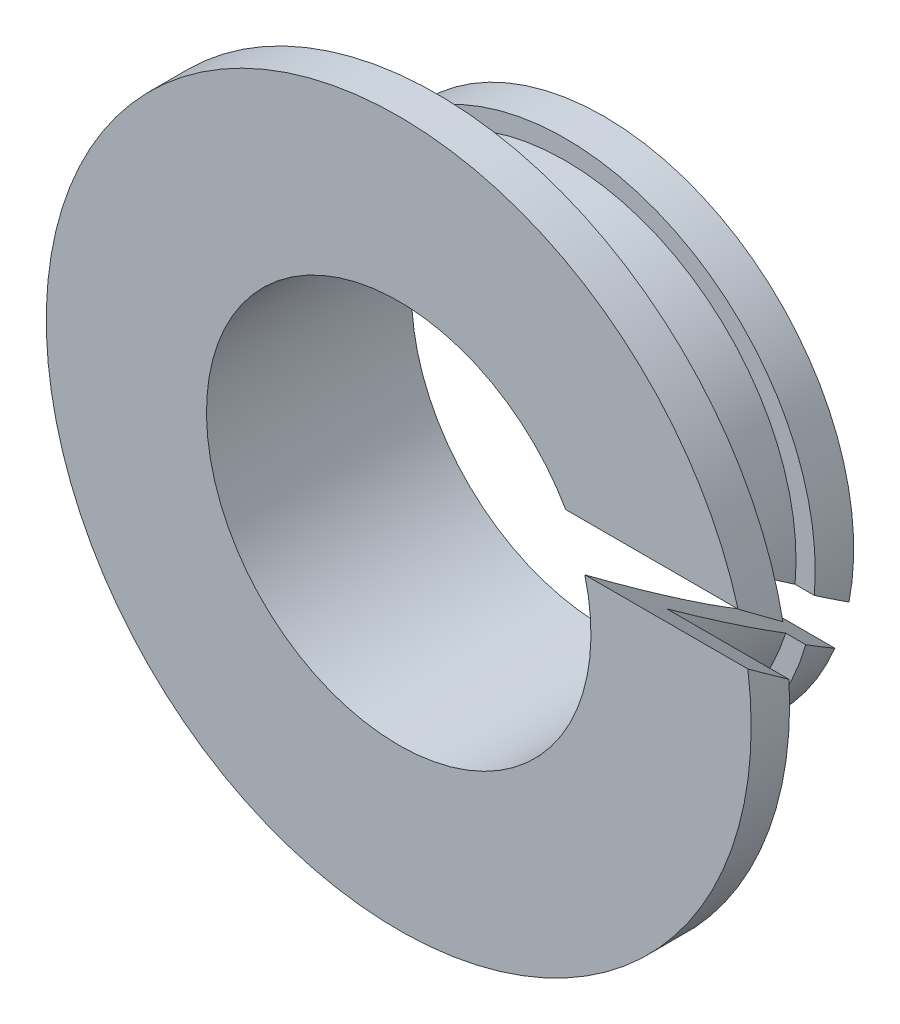
ISO-10303-21;
HEADER;
FILE_DESCRIPTION(('STEP AP214'),'2;1');
FILE_NAME('part.step','',(''),(''),'','','');
FILE_SCHEMA(('AUTOMOTIVE_DESIGN { 1 0 10303 214 1 1 1 1 }'));
ENDSEC;
DATA;
#1=APPLICATION_CONTEXT('core data for automotive mechanical design processes');
#2=APPLICATION_PROTOCOL_DEFINITION('international standard','automotive_design',2000,#1);
#3=PRODUCT_CONTEXT('',#1,'mechanical');
#4=PRODUCT('Part','Part','',(#3));
#5=PRODUCT_RELATED_PRODUCT_CATEGORY('part','',(#4));
#6=PRODUCT_DEFINITION_FORMATION('','',#4);
#7=PRODUCT_DEFINITION_CONTEXT('part definition',#1,'design');
#8=PRODUCT_DEFINITION('design','',#6,#7);
#9=PRODUCT_DEFINITION_SHAPE('','',#8);
#10=(LENGTH_UNIT() NAMED_UNIT(*) SI_UNIT(.MILLI.,.METRE.));
#11=(NAMED_UNIT(*) PLANE_ANGLE_UNIT() SI_UNIT($,.RADIAN.));
#12=(NAMED_UNIT(*) SI_UNIT($,.STERADIAN.) SOLID_ANGLE_UNIT());
#13=UNCERTAINTY_MEASURE_WITH_UNIT(LENGTH_MEASURE(1.E-05),#10,'distance_accuracy_value','');
#14=(GEOMETRIC_REPRESENTATION_CONTEXT(3) GLOBAL_UNCERTAINTY_ASSIGNED_CONTEXT((#13)) GLOBAL_UNIT_ASSIGNED_CONTEXT((#10,
#11,#12)) REPRESENTATION_CONTEXT('',''));
#15=CARTESIAN_POINT('',(0.,0.,0.));
#16=DIRECTION('',(0.,0.,1.));
#17=DIRECTION('',(1.,0.,0.));
#18=AXIS2_PLACEMENT_3D('',#15,#16,#17);
#19=CARTESIAN_POINT('',(0.,0.,0.6));
#20=DIRECTION('',(0.,0.,-1.));
#21=DIRECTION('',(-1.,0.,0.));
#22=AXIS2_PLACEMENT_3D('',#19,#20,#21);
#23=CYLINDRICAL_SURFACE('',#22,3.9);
#24=CARTESIAN_POINT('',(0.,0.,0.));
#25=DIRECTION('',(0.,0.,-1.));
#26=DIRECTION('',(-1.,0.,0.));
#27=AXIS2_PLACEMENT_3D('',#24,#25,#26);
#28=CIRCLE('',#27,3.9);
#29=CARTESIAN_POINT('',(3.60556877238189,-1.48656443776399,0.));
#30=VERTEX_POINT('',#29);
#31=CARTESIAN_POINT('',(3.82639956954659,-0.754099684507085,0.));
#32=VERTEX_POINT('',#31);
#33=EDGE_CURVE('E135',#30,#32,#28,.T.);
#34=ORIENTED_EDGE('',*,*,#33,.F.);
#35=CARTESIAN_POINT('',(0.,0.,2.12303403868634));
#36=DIRECTION('',(0.,0.81915204428899,-0.573576436351049));
#37=DIRECTION('',(0.,-0.573576436351049,-0.81915204428899));
#38=AXIS2_PLACEMENT_3D('',#35,#36,#37);
#39=ELLIPSE('',#38,6.79944250292225,3.9);
#40=CARTESIAN_POINT('',(3.75136054092912,-1.06643991483816,0.6));
#41=VERTEX_POINT('',#40);
#42=EDGE_CURVE('E44',#41,#30,#39,.T.);
#43=ORIENTED_EDGE('',*,*,#42,.F.);
#44=CARTESIAN_POINT('',(0.,0.,0.6));
#45=DIRECTION('',(0.,0.,-1.));
#46=DIRECTION('',(-1.,0.,0.));
#47=AXIS2_PLACEMENT_3D('',#44,#45,#46);
#48=CIRCLE('',#47,3.9);
#49=CARTESIAN_POINT('',(3.88567376286877,-0.333975161581263,0.6));
#50=VERTEX_POINT('',#49);
#51=EDGE_CURVE('E130',#41,#50,#48,.T.);
#52=ORIENTED_EDGE('',*,*,#51,.T.);
#53=CARTESIAN_POINT('',(0.,0.,1.07696596131366));
#54=DIRECTION('',(0.,-0.819152044288994,0.573576436351043));
#55=DIRECTION('',(0.,-0.573576436351043,-0.819152044288994));
#56=AXIS2_PLACEMENT_3D('',#53,#54,#55);
#57=ELLIPSE('',#56,6.79944250292232,3.9);
#58=EDGE_CURVE('E65',#50,#32,#57,.F.);
#59=ORIENTED_EDGE('',*,*,#58,.T.);
#60=EDGE_LOOP('',(#34,#43,#52,#59));
#61=FACE_BOUND('',#60,.T.);
#62=ADVANCED_FACE('F35',(#61),#23,.T.);
#63=CARTESIAN_POINT('',(2.98135214146983,0.333975161581271,2.6));
#64=DIRECTION('',(0.,0.81915204428899,-0.573576436351049));
#65=DIRECTION('',(0.,0.573576436351049,0.81915204428899));
#66=AXIS2_PLACEMENT_3D('',#63,#64,#65);
#67=PLANE('',#66);
#68=DIRECTION('',(1.,0.,0.));
#69=VECTOR('',#68,1.);
#70=CARTESIAN_POINT('',(0.,-1.48656443776399,0.));
#71=LINE('',#70,#69);
#72=CARTESIAN_POINT('',(2.60578705430345,-1.48656443776399,0.));
#73=VERTEX_POINT('',#72);
#74=EDGE_CURVE('E125',#73,#30,#71,.T.);
#75=ORIENTED_EDGE('',*,*,#74,.F.);
#76=CARTESIAN_POINT('',(0.,0.,2.12303403868634));
#77=DIRECTION('',(0.,0.81915204428899,-0.573576436351049));
#78=DIRECTION('',(0.,-0.573576436351049,-0.81915204428899));
#79=AXIS2_PLACEMENT_3D('',#76,#77,#78);
#80=ELLIPSE('',#79,5.23034038686327,3.);
#81=CARTESIAN_POINT('',(2.90367588856372,0.754099684507098,3.2));
#82=VERTEX_POINT('',#81);
#83=EDGE_CURVE('E114',#82,#73,#80,.T.);
#84=ORIENTED_EDGE('',*,*,#83,.F.);
#85=DIRECTION('',(-1.,0.,0.));
#86=VECTOR('',#85,1.);
#87=CARTESIAN_POINT('',(2.98135214146983,0.754099684507098,3.2));
#88=LINE('',#87,#86);
#89=CARTESIAN_POINT('',(5.44805778840738,0.754099684507098,3.2));
#90=VERTEX_POINT('',#89);
#91=EDGE_CURVE('E149',#90,#82,#88,.T.);
#92=ORIENTED_EDGE('',*,*,#91,.F.);
#93=CARTESIAN_POINT('',(0.,0.,2.12303403868634));
#94=DIRECTION('',(0.,0.81915204428899,-0.573576436351049));
#95=DIRECTION('',(0.,-0.573576436351049,-0.81915204428899));
#96=AXIS2_PLACEMENT_3D('',#93,#94,#95);
#97=ELLIPSE('',#96,9.58895737591599,5.5);
#98=CARTESIAN_POINT('',(5.4898506893582,0.333975161581271,2.6));
#99=VERTEX_POINT('',#98);
#100=EDGE_CURVE('E145',#90,#99,#97,.T.);
#101=ORIENTED_EDGE('',*,*,#100,.T.);
#102=DIRECTION('',(-1.,0.,0.));
#103=VECTOR('',#102,1.);
#104=CARTESIAN_POINT('',(2.98135214146983,0.333975161581271,2.6));
#105=LINE('',#104,#103);
#106=CARTESIAN_POINT('',(3.58447493943629,0.333975161581271,2.6));
#107=VERTEX_POINT('',#106);
#108=EDGE_CURVE('E170',#99,#107,#105,.T.);
#109=ORIENTED_EDGE('',*,*,#108,.T.);
#110=CARTESIAN_POINT('',(0.,0.,2.12303403868634));
#111=DIRECTION('',(0.,0.81915204428899,-0.573576436351049));
#112=DIRECTION('',(0.,-0.573576436351049,-0.81915204428899));
#113=AXIS2_PLACEMENT_3D('',#110,#111,#112);
#114=ELLIPSE('',#113,6.27640846423593,3.6);
#115=CARTESIAN_POINT('',(3.4384161918011,-1.06643991483816,0.6));
#116=VERTEX_POINT('',#115);
#117=EDGE_CURVE('E99',#107,#116,#114,.T.);
#118=ORIENTED_EDGE('',*,*,#117,.T.);
#119=DIRECTION('',(1.,0.,0.));
#120=VECTOR('',#119,1.);
#121=CARTESIAN_POINT('',(0.,-1.06643991483816,0.6));
#122=LINE('',#121,#120);
#123=EDGE_CURVE('E140',#116,#41,#122,.T.);
#124=ORIENTED_EDGE('',*,*,#123,.T.);
#125=ORIENTED_EDGE('',*,*,#42,.T.);
#126=EDGE_LOOP('',(#75,#84,#92,#101,#109,#118,#124,#125));
#127=FACE_BOUND('',#126,.T.);
#128=ADVANCED_FACE('F129',(#127),#67,.T.);
#129=CARTESIAN_POINT('',(5.39561914038046,1.06643991483815,2.6));
#130=DIRECTION('',(0.,-0.819152044288994,0.573576436351043));
#131=DIRECTION('',(0.,-0.573576436351043,-0.819152044288994));
#132=AXIS2_PLACEMENT_3D('',#129,#130,#131);
#133=PLANE('',#132);
#134=DIRECTION('',(-1.,0.,0.));
#135=VECTOR('',#134,1.);
#136=CARTESIAN_POINT('',(0.,-0.754099684507085,0.));
#137=LINE('',#136,#135);
#138=CARTESIAN_POINT('',(2.90367588856372,-0.754099684507085,0.));
#139=VERTEX_POINT('',#138);
#140=EDGE_CURVE('E126',#32,#139,#137,.T.);
#141=ORIENTED_EDGE('',*,*,#140,.F.);
#142=ORIENTED_EDGE('',*,*,#58,.F.);
#143=DIRECTION('',(-1.,0.,0.));
#144=VECTOR('',#143,1.);
#145=CARTESIAN_POINT('',(0.,-0.333975161581263,0.6));
#146=LINE('',#145,#144);
#147=CARTESIAN_POINT('',(3.58447493943629,-0.333975161581263,0.6));
#148=VERTEX_POINT('',#147);
#149=EDGE_CURVE('E133',#50,#148,#146,.T.);
#150=ORIENTED_EDGE('',*,*,#149,.T.);
#151=CARTESIAN_POINT('',(0.,0.,1.07696596131366));
#152=DIRECTION('',(0.,-0.819152044288994,0.573576436351043));
#153=DIRECTION('',(0.,-0.573576436351043,-0.819152044288994));
#154=AXIS2_PLACEMENT_3D('',#151,#152,#153);
#155=ELLIPSE('',#154,6.27640846423599,3.6);
#156=CARTESIAN_POINT('',(3.4384161918011,1.06643991483815,2.6));
#157=VERTEX_POINT('',#156);
#158=EDGE_CURVE('E143',#157,#148,#155,.F.);
#159=ORIENTED_EDGE('',*,*,#158,.F.);
#160=DIRECTION('',(1.,0.,0.));
#161=VECTOR('',#160,1.);
#162=CARTESIAN_POINT('',(5.39561914038046,1.06643991483815,2.6));
#163=LINE('',#162,#161);
#164=CARTESIAN_POINT('',(5.39561914038046,1.06643991483815,2.6));
#165=VERTEX_POINT('',#164);
#166=EDGE_CURVE('E163',#157,#165,#163,.T.);
#167=ORIENTED_EDGE('',*,*,#166,.T.);
#168=CARTESIAN_POINT('',(0.,0.,1.07696596131366));
#169=DIRECTION('',(0.,-0.819152044288994,0.573576436351043));
#170=DIRECTION('',(0.,-0.573576436351043,-0.819152044288994));
#171=AXIS2_PLACEMENT_3D('',#168,#169,#170);
#172=ELLIPSE('',#171,9.58895737591609,5.5);
#173=CARTESIAN_POINT('',(5.29529283159822,1.48656443776397,3.2));
#174=VERTEX_POINT('',#173);
#175=EDGE_CURVE('E148',#174,#165,#172,.F.);
#176=ORIENTED_EDGE('',*,*,#175,.F.);
#177=DIRECTION('',(1.,0.,0.));
#178=VECTOR('',#177,1.);
#179=CARTESIAN_POINT('',(5.39561914038046,1.48656443776397,3.2));
#180=LINE('',#179,#178);
#181=CARTESIAN_POINT('',(2.60578705430346,1.48656443776397,3.2));
#182=VERTEX_POINT('',#181);
#183=EDGE_CURVE('E93',#182,#174,#180,.T.);
#184=ORIENTED_EDGE('',*,*,#183,.F.);
#185=CARTESIAN_POINT('',(0.,0.,1.07696596131366));
#186=DIRECTION('',(0.,-0.819152044288994,0.573576436351043));
#187=DIRECTION('',(0.,-0.573576436351043,-0.819152044288994));
#188=AXIS2_PLACEMENT_3D('',#185,#186,#187);
#189=ELLIPSE('',#188,5.23034038686332,3.);
#190=EDGE_CURVE('E88',#182,#139,#189,.F.);
#191=ORIENTED_EDGE('',*,*,#190,.T.);
#192=EDGE_LOOP('',(#141,#142,#150,#159,#167,#176,#184,#191));
#193=FACE_BOUND('',#192,.T.);
#194=ADVANCED_FACE('F37',(#193),#133,.T.);
#195=CARTESIAN_POINT('',(0.,0.,0.6));
#196=DIRECTION('',(0.,0.,-1.));
#197=DIRECTION('',(-1.,0.,0.));
#198=AXIS2_PLACEMENT_3D('',#195,#196,#197);
#199=PLANE('',#198);
#200=CARTESIAN_POINT('',(0.,0.,0.6));
#201=DIRECTION('',(0.,0.,1.));
#202=DIRECTION('',(-1.,0.,0.));
#203=AXIS2_PLACEMENT_3D('',#200,#201,#202);
#204=CIRCLE('',#203,3.6);
#205=EDGE_CURVE('E52',#148,#116,#204,.T.);
#206=ORIENTED_EDGE('',*,*,#205,.F.);
#207=ORIENTED_EDGE('',*,*,#149,.F.);
#208=ORIENTED_EDGE('',*,*,#51,.F.);
#209=ORIENTED_EDGE('',*,*,#123,.F.);
#210=EDGE_LOOP('',(#206,#207,#208,#209));
#211=FACE_BOUND('',#210,.T.);
#212=ADVANCED_FACE('F180',(#211),#199,.F.);
#213=CARTESIAN_POINT('',(0.,0.,0.));
#214=DIRECTION('',(0.,0.,-1.));
#215=DIRECTION('',(-1.,0.,0.));
#216=AXIS2_PLACEMENT_3D('',#213,#214,#215);
#217=PLANE('',#216);
#218=CARTESIAN_POINT('',(0.,0.,0.));
#219=DIRECTION('',(0.,0.,1.));
#220=DIRECTION('',(1.,0.,0.));
#221=AXIS2_PLACEMENT_3D('',#218,#219,#220);
#222=CIRCLE('',#221,3.);
#223=EDGE_CURVE('E117',#139,#73,#222,.T.);
#224=ORIENTED_EDGE('',*,*,#223,.T.);
#225=ORIENTED_EDGE('',*,*,#74,.T.);
#226=ORIENTED_EDGE('',*,*,#33,.T.);
#227=ORIENTED_EDGE('',*,*,#140,.T.);
#228=EDGE_LOOP('',(#224,#225,#226,#227));
#229=FACE_BOUND('',#228,.T.);
#230=ADVANCED_FACE('F123',(#229),#217,.T.);
#231=CARTESIAN_POINT('',(0.,0.,2.6));
#232=DIRECTION('',(0.,0.,-1.));
#233=DIRECTION('',(-1.,0.,0.));
#234=AXIS2_PLACEMENT_3D('',#231,#232,#233);
#235=CYLINDRICAL_SURFACE('',#234,3.6);
#236=ORIENTED_EDGE('',*,*,#205,.T.);
#237=ORIENTED_EDGE('',*,*,#117,.F.);
#238=CARTESIAN_POINT('',(0.,0.,2.6));
#239=DIRECTION('',(0.,0.,1.));
#240=DIRECTION('',(-1.,0.,0.));
#241=AXIS2_PLACEMENT_3D('',#238,#239,#240);
#242=CIRCLE('',#241,3.6);
#243=EDGE_CURVE('E144',#157,#107,#242,.T.);
#244=ORIENTED_EDGE('',*,*,#243,.F.);
#245=ORIENTED_EDGE('',*,*,#158,.T.);
#246=EDGE_LOOP('',(#236,#237,#244,#245));
#247=FACE_BOUND('',#246,.T.);
#248=ADVANCED_FACE('F177',(#247),#235,.T.);
#249=CARTESIAN_POINT('',(0.,0.,3.2));
#250=DIRECTION('',(0.,0.,-1.));
#251=DIRECTION('',(-1.,0.,0.));
#252=AXIS2_PLACEMENT_3D('',#249,#250,#251);
#253=CYLINDRICAL_SURFACE('',#252,5.5);
#254=CARTESIAN_POINT('',(0.,0.,2.6));
#255=DIRECTION('',(0.,0.,1.));
#256=DIRECTION('',(-1.,0.,0.));
#257=AXIS2_PLACEMENT_3D('',#254,#255,#256);
#258=CIRCLE('',#257,5.5);
#259=EDGE_CURVE('E127',#165,#99,#258,.T.);
#260=ORIENTED_EDGE('',*,*,#259,.T.);
#261=ORIENTED_EDGE('',*,*,#100,.F.);
#262=CARTESIAN_POINT('',(0.,0.,3.2));
#263=DIRECTION('',(0.,0.,1.));
#264=DIRECTION('',(-1.,0.,0.));
#265=AXIS2_PLACEMENT_3D('',#262,#263,#264);
#266=CIRCLE('',#265,5.5);
#267=EDGE_CURVE('E150',#174,#90,#266,.T.);
#268=ORIENTED_EDGE('',*,*,#267,.F.);
#269=ORIENTED_EDGE('',*,*,#175,.T.);
#270=EDGE_LOOP('',(#260,#261,#268,#269));
#271=FACE_BOUND('',#270,.T.);
#272=ADVANCED_FACE('F168',(#271),#253,.T.);
#273=CARTESIAN_POINT('',(0.,0.,3.2));
#274=DIRECTION('',(0.,0.,-1.));
#275=DIRECTION('',(-1.,0.,0.));
#276=AXIS2_PLACEMENT_3D('',#273,#274,#275);
#277=PLANE('',#276);
#278=ORIENTED_EDGE('',*,*,#91,.T.);
#279=CARTESIAN_POINT('',(0.,0.,3.2));
#280=DIRECTION('',(0.,0.,-1.));
#281=DIRECTION('',(-1.,0.,0.));
#282=AXIS2_PLACEMENT_3D('',#279,#280,#281);
#283=CIRCLE('',#282,3.);
#284=EDGE_CURVE('E11',#82,#182,#283,.T.);
#285=ORIENTED_EDGE('',*,*,#284,.T.);
#286=ORIENTED_EDGE('',*,*,#183,.T.);
#287=ORIENTED_EDGE('',*,*,#267,.T.);
#288=EDGE_LOOP('',(#278,#285,#286,#287));
#289=FACE_BOUND('',#288,.T.);
#290=ADVANCED_FACE('F217',(#289),#277,.F.);
#291=CARTESIAN_POINT('',(0.,0.,2.6));
#292=DIRECTION('',(0.,0.,-1.));
#293=DIRECTION('',(-1.,0.,0.));
#294=AXIS2_PLACEMENT_3D('',#291,#292,#293);
#295=PLANE('',#294);
#296=ORIENTED_EDGE('',*,*,#166,.F.);
#297=ORIENTED_EDGE('',*,*,#243,.T.);
#298=ORIENTED_EDGE('',*,*,#108,.F.);
#299=ORIENTED_EDGE('',*,*,#259,.F.);
#300=EDGE_LOOP('',(#296,#297,#298,#299));
#301=FACE_BOUND('',#300,.T.);
#302=ADVANCED_FACE('F179',(#301),#295,.T.);
#303=CARTESIAN_POINT('',(0.,0.,0.));
#304=DIRECTION('',(0.,0.,1.));
#305=DIRECTION('',(1.,0.,0.));
#306=AXIS2_PLACEMENT_3D('',#303,#304,#305);
#307=CYLINDRICAL_SURFACE('',#306,3.);
#308=ORIENTED_EDGE('',*,*,#83,.T.);
#309=ORIENTED_EDGE('',*,*,#223,.F.);
#310=ORIENTED_EDGE('',*,*,#190,.F.);
#311=ORIENTED_EDGE('',*,*,#284,.F.);
#312=EDGE_LOOP('',(#308,#309,#310,#311));
#313=FACE_BOUND('',#312,.T.);
#314=ADVANCED_FACE('F116',(#313),#307,.F.);
#315=CLOSED_SHELL('',(#62,#128,#194,#212,#230,#248,#272,#290,#302,#314));
#316=MANIFOLD_SOLID_BREP('B2',#315);
#317=ADVANCED_BREP_SHAPE_REPRESENTATION('',(#18,#316),#14);
#318=SHAPE_DEFINITION_REPRESENTATION(#9,#317);
ENDSEC;
END-ISO-10303-21;
